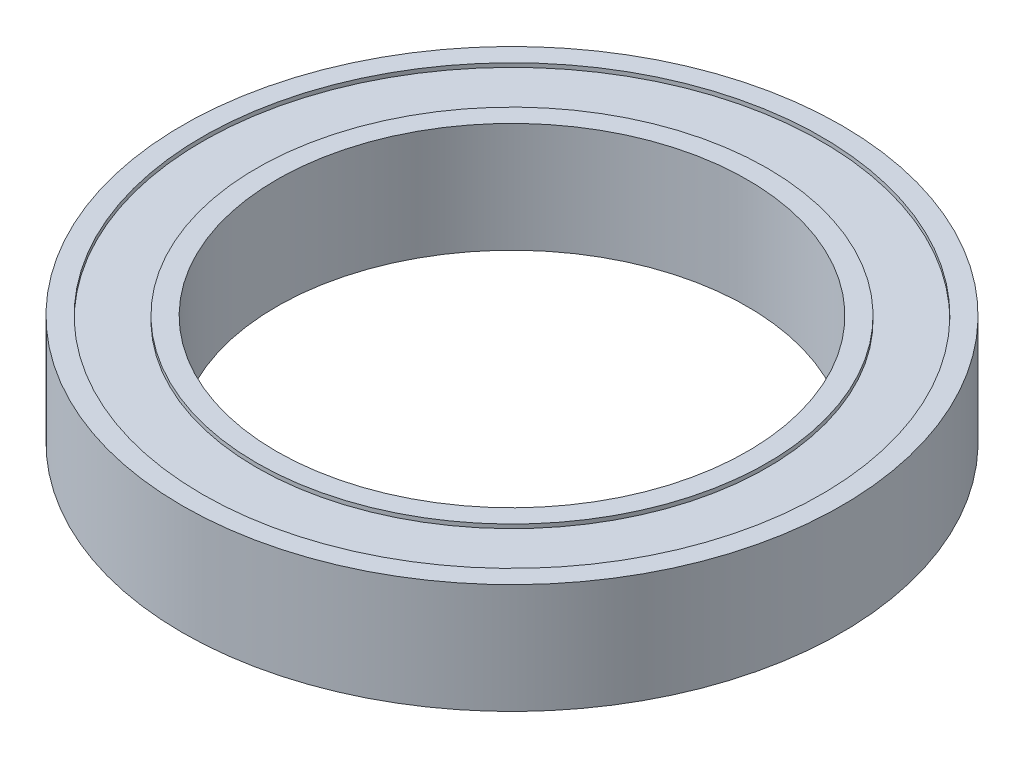
ISO-10303-21;
HEADER;
FILE_DESCRIPTION(('STEP AP214'),'2;1');
FILE_NAME('part.step','',(''),(''),'','','');
FILE_SCHEMA(('AUTOMOTIVE_DESIGN { 1 0 10303 214 1 1 1 1 }'));
ENDSEC;
DATA;
#1=APPLICATION_CONTEXT('core data for automotive mechanical design processes');
#2=APPLICATION_PROTOCOL_DEFINITION('international standard','automotive_design',2000,#1);
#3=PRODUCT_CONTEXT('',#1,'mechanical');
#4=PRODUCT('Part','Part','',(#3));
#5=PRODUCT_RELATED_PRODUCT_CATEGORY('part','',(#4));
#6=PRODUCT_DEFINITION_FORMATION('','',#4);
#7=PRODUCT_DEFINITION_CONTEXT('part definition',#1,'design');
#8=PRODUCT_DEFINITION('design','',#6,#7);
#9=PRODUCT_DEFINITION_SHAPE('','',#8);
#10=(LENGTH_UNIT() NAMED_UNIT(*) SI_UNIT(.MILLI.,.METRE.));
#11=(NAMED_UNIT(*) PLANE_ANGLE_UNIT() SI_UNIT($,.RADIAN.));
#12=(NAMED_UNIT(*) SI_UNIT($,.STERADIAN.) SOLID_ANGLE_UNIT());
#13=UNCERTAINTY_MEASURE_WITH_UNIT(LENGTH_MEASURE(1.E-05),#10,'distance_accuracy_value','');
#14=(GEOMETRIC_REPRESENTATION_CONTEXT(3) GLOBAL_UNCERTAINTY_ASSIGNED_CONTEXT((#13)) GLOBAL_UNIT_ASSIGNED_CONTEXT((#10,
#11,#12)) REPRESENTATION_CONTEXT('',''));
#15=CARTESIAN_POINT('',(0.,0.,0.));
#16=DIRECTION('',(0.,0.,1.));
#17=DIRECTION('',(1.,0.,0.));
#18=AXIS2_PLACEMENT_3D('',#15,#16,#17);
#19=CARTESIAN_POINT('',(0.,0.,0.));
#20=DIRECTION('',(0.,1.,0.));
#21=DIRECTION('',(0.,0.,1.));
#22=AXIS2_PLACEMENT_3D('',#19,#20,#21);
#23=PLANE('',#22);
#24=CARTESIAN_POINT('',(0.,0.,0.));
#25=DIRECTION('',(0.,1.,0.));
#26=DIRECTION('',(0.,0.,1.));
#27=AXIS2_PLACEMENT_3D('',#24,#25,#26);
#28=CIRCLE('',#27,15.);
#29=CARTESIAN_POINT('',(0.,0.,15.));
#30=VERTEX_POINT('',#29);
#31=EDGE_CURVE('E56',#30,#30,#28,.T.);
#32=ORIENTED_EDGE('',*,*,#31,.T.);
#33=EDGE_LOOP('',(#32));
#34=FACE_BOUND('',#33,.T.);
#35=CARTESIAN_POINT('',(0.,0.,0.));
#36=DIRECTION('',(0.,1.,0.));
#37=DIRECTION('',(0.,0.,1.));
#38=AXIS2_PLACEMENT_3D('',#35,#36,#37);
#39=CIRCLE('',#38,16.27);
#40=CARTESIAN_POINT('',(0.,0.,16.27));
#41=VERTEX_POINT('',#40);
#42=EDGE_CURVE('E80',#41,#41,#39,.T.);
#43=ORIENTED_EDGE('',*,*,#42,.F.);
#44=EDGE_LOOP('',(#43));
#45=FACE_BOUND('',#44,.T.);
#46=ADVANCED_FACE('F43',(#34,#45),#23,.F.);
#47=CARTESIAN_POINT('',(0.,7.,0.));
#48=DIRECTION('',(0.,1.,0.));
#49=DIRECTION('',(0.,0.,1.));
#50=AXIS2_PLACEMENT_3D('',#47,#48,#49);
#51=PLANE('',#50);
#52=CARTESIAN_POINT('',(0.,7.,0.));
#53=DIRECTION('',(0.,1.,0.));
#54=DIRECTION('',(0.,0.,1.));
#55=AXIS2_PLACEMENT_3D('',#52,#53,#54);
#56=CIRCLE('',#55,15.);
#57=CARTESIAN_POINT('',(0.,7.,15.));
#58=VERTEX_POINT('',#57);
#59=EDGE_CURVE('E54',#58,#58,#56,.T.);
#60=ORIENTED_EDGE('',*,*,#59,.F.);
#61=EDGE_LOOP('',(#60));
#62=FACE_BOUND('',#61,.T.);
#63=CARTESIAN_POINT('',(0.,7.,0.));
#64=DIRECTION('',(0.,1.,0.));
#65=DIRECTION('',(0.,0.,1.));
#66=AXIS2_PLACEMENT_3D('',#63,#64,#65);
#67=CIRCLE('',#66,16.27);
#68=CARTESIAN_POINT('',(0.,7.,16.27));
#69=VERTEX_POINT('',#68);
#70=EDGE_CURVE('E68',#69,#69,#67,.T.);
#71=ORIENTED_EDGE('',*,*,#70,.T.);
#72=EDGE_LOOP('',(#71));
#73=FACE_BOUND('',#72,.T.);
#74=ADVANCED_FACE('F96',(#62,#73),#51,.T.);
#75=CARTESIAN_POINT('',(0.,7.,0.));
#76=DIRECTION('',(0.,1.,0.));
#77=DIRECTION('',(0.,0.,1.));
#78=AXIS2_PLACEMENT_3D('',#75,#76,#77);
#79=CIRCLE('',#78,19.73);
#80=CARTESIAN_POINT('',(0.,7.,19.73));
#81=VERTEX_POINT('',#80);
#82=EDGE_CURVE('E62',#81,#81,#79,.T.);
#83=ORIENTED_EDGE('',*,*,#82,.F.);
#84=EDGE_LOOP('',(#83));
#85=FACE_BOUND('',#84,.T.);
#86=CARTESIAN_POINT('',(0.,7.,0.));
#87=DIRECTION('',(0.,1.,0.));
#88=DIRECTION('',(0.,0.,1.));
#89=AXIS2_PLACEMENT_3D('',#86,#87,#88);
#90=CIRCLE('',#89,21.);
#91=CARTESIAN_POINT('',(0.,7.,21.));
#92=VERTEX_POINT('',#91);
#93=EDGE_CURVE('E10',#92,#92,#90,.T.);
#94=ORIENTED_EDGE('',*,*,#93,.T.);
#95=EDGE_LOOP('',(#94));
#96=FACE_BOUND('',#95,.T.);
#97=ADVANCED_FACE('F104',(#85,#96),#51,.T.);
#98=CARTESIAN_POINT('',(0.,0.,0.));
#99=DIRECTION('',(0.,1.,0.));
#100=DIRECTION('',(0.,0.,1.));
#101=AXIS2_PLACEMENT_3D('',#98,#99,#100);
#102=CIRCLE('',#101,19.73);
#103=CARTESIAN_POINT('',(0.,0.,19.73));
#104=VERTEX_POINT('',#103);
#105=EDGE_CURVE('E74',#104,#104,#102,.T.);
#106=ORIENTED_EDGE('',*,*,#105,.T.);
#107=EDGE_LOOP('',(#106));
#108=FACE_BOUND('',#107,.T.);
#109=CARTESIAN_POINT('',(0.,0.,0.));
#110=DIRECTION('',(0.,1.,0.));
#111=DIRECTION('',(0.,0.,1.));
#112=AXIS2_PLACEMENT_3D('',#109,#110,#111);
#113=CIRCLE('',#112,21.);
#114=CARTESIAN_POINT('',(0.,0.,21.));
#115=VERTEX_POINT('',#114);
#116=EDGE_CURVE('E47',#115,#115,#113,.T.);
#117=ORIENTED_EDGE('',*,*,#116,.F.);
#118=EDGE_LOOP('',(#117));
#119=FACE_BOUND('',#118,.T.);
#120=ADVANCED_FACE('F98',(#108,#119),#23,.F.);
#121=CARTESIAN_POINT('',(0.,7.,0.));
#122=DIRECTION('',(0.,-1.,0.));
#123=DIRECTION('',(0.,0.,-1.));
#124=AXIS2_PLACEMENT_3D('',#121,#122,#123);
#125=CYLINDRICAL_SURFACE('',#124,21.);
#126=ORIENTED_EDGE('',*,*,#93,.F.);
#127=EDGE_LOOP('',(#126));
#128=FACE_BOUND('',#127,.T.);
#129=ORIENTED_EDGE('',*,*,#116,.T.);
#130=EDGE_LOOP('',(#129));
#131=FACE_BOUND('',#130,.T.);
#132=ADVANCED_FACE('F45',(#128,#131),#125,.T.);
#133=CARTESIAN_POINT('',(0.,7.,0.));
#134=DIRECTION('',(0.,-1.,0.));
#135=DIRECTION('',(0.,0.,-1.));
#136=AXIS2_PLACEMENT_3D('',#133,#134,#135);
#137=CYLINDRICAL_SURFACE('',#136,15.);
#138=ORIENTED_EDGE('',*,*,#59,.T.);
#139=EDGE_LOOP('',(#138));
#140=FACE_BOUND('',#139,.T.);
#141=ORIENTED_EDGE('',*,*,#31,.F.);
#142=EDGE_LOOP('',(#141));
#143=FACE_BOUND('',#142,.T.);
#144=ADVANCED_FACE('F112',(#140,#143),#137,.F.);
#145=CARTESIAN_POINT('',(0.,6.746,0.));
#146=DIRECTION('',(0.,1.,0.));
#147=DIRECTION('',(0.,0.,1.));
#148=AXIS2_PLACEMENT_3D('',#145,#146,#147);
#149=CYLINDRICAL_SURFACE('',#148,19.73);
#150=CARTESIAN_POINT('',(0.,6.746,0.));
#151=DIRECTION('',(0.,1.,0.));
#152=DIRECTION('',(0.,0.,1.));
#153=AXIS2_PLACEMENT_3D('',#150,#151,#152);
#154=CIRCLE('',#153,19.73);
#155=CARTESIAN_POINT('',(0.,6.746,19.73));
#156=VERTEX_POINT('',#155);
#157=EDGE_CURVE('E59',#156,#156,#154,.T.);
#158=ORIENTED_EDGE('',*,*,#157,.F.);
#159=EDGE_LOOP('',(#158));
#160=FACE_BOUND('',#159,.T.);
#161=ORIENTED_EDGE('',*,*,#82,.T.);
#162=EDGE_LOOP('',(#161));
#163=FACE_BOUND('',#162,.T.);
#164=ADVANCED_FACE('F136',(#160,#163),#149,.F.);
#165=CARTESIAN_POINT('',(0.,6.746,0.));
#166=DIRECTION('',(0.,1.,0.));
#167=DIRECTION('',(0.,0.,1.));
#168=AXIS2_PLACEMENT_3D('',#165,#166,#167);
#169=PLANE('',#168);
#170=CARTESIAN_POINT('',(0.,6.746,0.));
#171=DIRECTION('',(0.,1.,0.));
#172=DIRECTION('',(0.,0.,1.));
#173=AXIS2_PLACEMENT_3D('',#170,#171,#172);
#174=CIRCLE('',#173,16.27);
#175=CARTESIAN_POINT('',(0.,6.746,16.27));
#176=VERTEX_POINT('',#175);
#177=EDGE_CURVE('E65',#176,#176,#174,.T.);
#178=ORIENTED_EDGE('',*,*,#177,.F.);
#179=EDGE_LOOP('',(#178));
#180=FACE_BOUND('',#179,.T.);
#181=ORIENTED_EDGE('',*,*,#157,.T.);
#182=EDGE_LOOP('',(#181));
#183=FACE_BOUND('',#182,.T.);
#184=ADVANCED_FACE('F132',(#180,#183),#169,.T.);
#185=CARTESIAN_POINT('',(0.,6.746,0.));
#186=DIRECTION('',(0.,1.,0.));
#187=DIRECTION('',(0.,0.,1.));
#188=AXIS2_PLACEMENT_3D('',#185,#186,#187);
#189=CYLINDRICAL_SURFACE('',#188,16.27);
#190=ORIENTED_EDGE('',*,*,#177,.T.);
#191=EDGE_LOOP('',(#190));
#192=FACE_BOUND('',#191,.T.);
#193=ORIENTED_EDGE('',*,*,#70,.F.);
#194=EDGE_LOOP('',(#193));
#195=FACE_BOUND('',#194,.T.);
#196=ADVANCED_FACE('F127',(#192,#195),#189,.T.);
#197=CARTESIAN_POINT('',(0.,0.254,0.));
#198=DIRECTION('',(0.,-1.,0.));
#199=DIRECTION('',(0.,0.,1.));
#200=AXIS2_PLACEMENT_3D('',#197,#198,#199);
#201=PLANE('',#200);
#202=CARTESIAN_POINT('',(0.,0.254,0.));
#203=DIRECTION('',(0.,1.,0.));
#204=DIRECTION('',(0.,0.,1.));
#205=AXIS2_PLACEMENT_3D('',#202,#203,#204);
#206=CIRCLE('',#205,19.73);
#207=CARTESIAN_POINT('',(0.,0.254,19.73));
#208=VERTEX_POINT('',#207);
#209=EDGE_CURVE('E71',#208,#208,#206,.T.);
#210=ORIENTED_EDGE('',*,*,#209,.F.);
#211=EDGE_LOOP('',(#210));
#212=FACE_BOUND('',#211,.T.);
#213=CARTESIAN_POINT('',(0.,0.254,0.));
#214=DIRECTION('',(0.,1.,0.));
#215=DIRECTION('',(0.,0.,1.));
#216=AXIS2_PLACEMENT_3D('',#213,#214,#215);
#217=CIRCLE('',#216,16.27);
#218=CARTESIAN_POINT('',(0.,0.254,16.27));
#219=VERTEX_POINT('',#218);
#220=EDGE_CURVE('E77',#219,#219,#217,.T.);
#221=ORIENTED_EDGE('',*,*,#220,.T.);
#222=EDGE_LOOP('',(#221));
#223=FACE_BOUND('',#222,.T.);
#224=ADVANCED_FACE('F86',(#212,#223),#201,.T.);
#225=CARTESIAN_POINT('',(0.,0.254,0.));
#226=DIRECTION('',(0.,-1.,0.));
#227=DIRECTION('',(0.,0.,-1.));
#228=AXIS2_PLACEMENT_3D('',#225,#226,#227);
#229=CYLINDRICAL_SURFACE('',#228,19.73);
#230=ORIENTED_EDGE('',*,*,#209,.T.);
#231=EDGE_LOOP('',(#230));
#232=FACE_BOUND('',#231,.T.);
#233=ORIENTED_EDGE('',*,*,#105,.F.);
#234=EDGE_LOOP('',(#233));
#235=FACE_BOUND('',#234,.T.);
#236=ADVANCED_FACE('F91',(#232,#235),#229,.F.);
#237=CARTESIAN_POINT('',(0.,0.254,0.));
#238=DIRECTION('',(0.,-1.,0.));
#239=DIRECTION('',(0.,0.,-1.));
#240=AXIS2_PLACEMENT_3D('',#237,#238,#239);
#241=CYLINDRICAL_SURFACE('',#240,16.27);
#242=ORIENTED_EDGE('',*,*,#220,.F.);
#243=EDGE_LOOP('',(#242));
#244=FACE_BOUND('',#243,.T.);
#245=ORIENTED_EDGE('',*,*,#42,.T.);
#246=EDGE_LOOP('',(#245));
#247=FACE_BOUND('',#246,.T.);
#248=ADVANCED_FACE('F88',(#244,#247),#241,.T.);
#249=CLOSED_SHELL('',(#46,#74,#97,#120,#132,#144,#164,#184,#196,#224,#236,#248));
#250=MANIFOLD_SOLID_BREP('B2',#249);
#251=ADVANCED_BREP_SHAPE_REPRESENTATION('',(#18,#250),#14);
#252=SHAPE_DEFINITION_REPRESENTATION(#9,#251);
ENDSEC;
END-ISO-10303-21;
